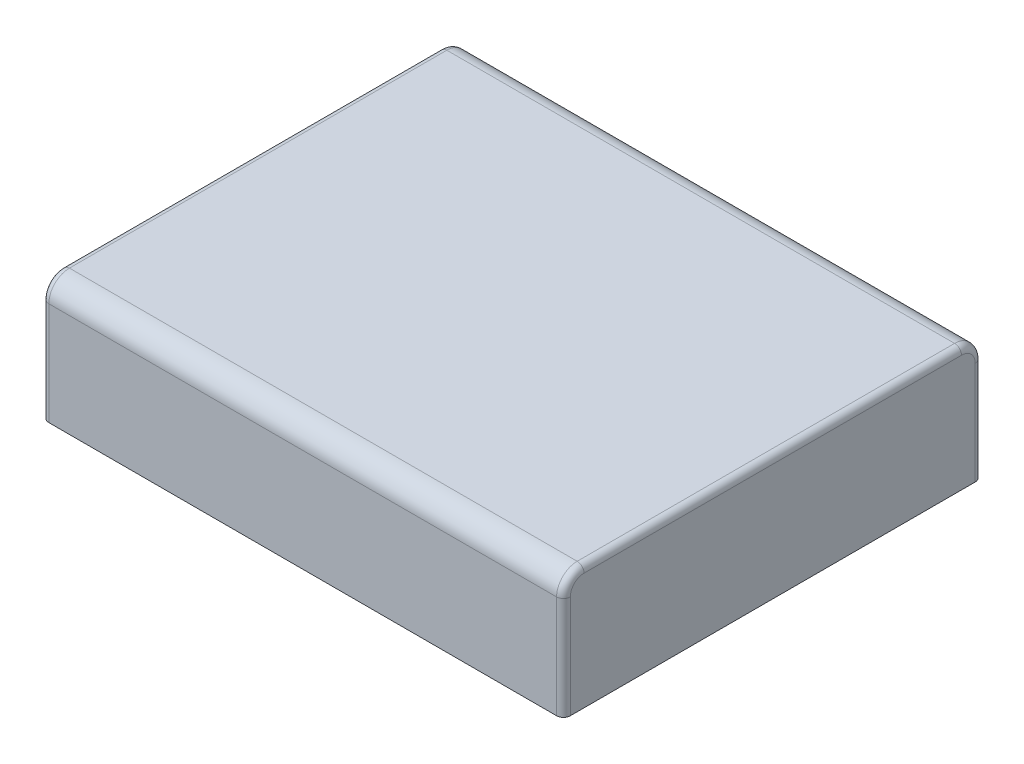
ISO-10303-21;
HEADER;
FILE_DESCRIPTION(('STEP AP214'),'2;1');
FILE_NAME('part.step','',(''),(''),'','','');
FILE_SCHEMA(('AUTOMOTIVE_DESIGN { 1 0 10303 214 1 1 1 1 }'));
ENDSEC;
DATA;
#1=APPLICATION_CONTEXT('core data for automotive mechanical design processes');
#2=APPLICATION_PROTOCOL_DEFINITION('international standard','automotive_design',2000,#1);
#3=PRODUCT_CONTEXT('',#1,'mechanical');
#4=PRODUCT('Part','Part','',(#3));
#5=PRODUCT_RELATED_PRODUCT_CATEGORY('part','',(#4));
#6=PRODUCT_DEFINITION_FORMATION('','',#4);
#7=PRODUCT_DEFINITION_CONTEXT('part definition',#1,'design');
#8=PRODUCT_DEFINITION('design','',#6,#7);
#9=PRODUCT_DEFINITION_SHAPE('','',#8);
#10=(LENGTH_UNIT() NAMED_UNIT(*) SI_UNIT(.MILLI.,.METRE.));
#11=(NAMED_UNIT(*) PLANE_ANGLE_UNIT() SI_UNIT($,.RADIAN.));
#12=(NAMED_UNIT(*) SI_UNIT($,.STERADIAN.) SOLID_ANGLE_UNIT());
#13=UNCERTAINTY_MEASURE_WITH_UNIT(LENGTH_MEASURE(1.E-05),#10,'distance_accuracy_value','');
#14=(GEOMETRIC_REPRESENTATION_CONTEXT(3) GLOBAL_UNCERTAINTY_ASSIGNED_CONTEXT((#13)) GLOBAL_UNIT_ASSIGNED_CONTEXT((#10,
#11,#12)) REPRESENTATION_CONTEXT('',''));
#15=CARTESIAN_POINT('',(0.,0.,0.));
#16=DIRECTION('',(0.,0.,1.));
#17=DIRECTION('',(1.,0.,0.));
#18=AXIS2_PLACEMENT_3D('',#15,#16,#17);
#19=CARTESIAN_POINT('',(38.,18.,-30.5));
#20=DIRECTION('',(-1.,0.,0.));
#21=DIRECTION('',(0.,0.,1.));
#22=AXIS2_PLACEMENT_3D('',#19,#20,#21);
#23=PLANE('',#22);
#24=DIRECTION('',(0.,0.,-1.));
#25=VECTOR('',#24,1.);
#26=CARTESIAN_POINT('',(38.,0.,-30.5));
#27=LINE('',#26,#25);
#28=CARTESIAN_POINT('',(38.,0.,29.5));
#29=VERTEX_POINT('',#28);
#30=CARTESIAN_POINT('',(38.,0.,-29.5));
#31=VERTEX_POINT('',#30);
#32=EDGE_CURVE('E128',#29,#31,#27,.T.);
#33=ORIENTED_EDGE('',*,*,#32,.T.);
#34=DIRECTION('',(0.,-1.,0.));
#35=VECTOR('',#34,1.);
#36=CARTESIAN_POINT('',(38.,18.,-29.5));
#37=LINE('',#36,#35);
#38=CARTESIAN_POINT('',(38.,15.,-29.5));
#39=VERTEX_POINT('',#38);
#40=EDGE_CURVE('E219',#31,#39,#37,.F.);
#41=ORIENTED_EDGE('',*,*,#40,.T.);
#42=CARTESIAN_POINT('',(38.,15.,-27.5));
#43=DIRECTION('',(-1.,0.,0.));
#44=DIRECTION('',(0.,0.,1.));
#45=AXIS2_PLACEMENT_3D('',#42,#43,#44);
#46=CIRCLE('',#45,2.);
#47=CARTESIAN_POINT('',(38.,17.,-27.5));
#48=VERTEX_POINT('',#47);
#49=EDGE_CURVE('E216',#39,#48,#46,.F.);
#50=ORIENTED_EDGE('',*,*,#49,.T.);
#51=DIRECTION('',(0.,0.,-1.));
#52=VECTOR('',#51,1.);
#53=CARTESIAN_POINT('',(38.,17.,27.5));
#54=LINE('',#53,#52);
#55=CARTESIAN_POINT('',(38.,17.,27.5));
#56=VERTEX_POINT('',#55);
#57=EDGE_CURVE('E214',#48,#56,#54,.F.);
#58=ORIENTED_EDGE('',*,*,#57,.T.);
#59=CARTESIAN_POINT('',(38.,15.,27.5));
#60=DIRECTION('',(-1.,0.,0.));
#61=DIRECTION('',(0.,0.,1.));
#62=AXIS2_PLACEMENT_3D('',#59,#60,#61);
#63=CIRCLE('',#62,2.);
#64=CARTESIAN_POINT('',(38.,15.,29.5));
#65=VERTEX_POINT('',#64);
#66=EDGE_CURVE('E131',#56,#65,#63,.F.);
#67=ORIENTED_EDGE('',*,*,#66,.T.);
#68=DIRECTION('',(0.,-1.,0.));
#69=VECTOR('',#68,1.);
#70=CARTESIAN_POINT('',(38.,18.,29.5));
#71=LINE('',#70,#69);
#72=EDGE_CURVE('E126',#65,#29,#71,.T.);
#73=ORIENTED_EDGE('',*,*,#72,.T.);
#74=EDGE_LOOP('',(#33,#41,#50,#58,#67,#73));
#75=FACE_BOUND('',#74,.T.);
#76=ADVANCED_FACE('F34',(#75),#23,.F.);
#77=CARTESIAN_POINT('',(-38.,18.,-30.5));
#78=DIRECTION('',(0.,0.,1.));
#79=DIRECTION('',(1.,0.,0.));
#80=AXIS2_PLACEMENT_3D('',#77,#78,#79);
#81=PLANE('',#80);
#82=DIRECTION('',(-1.,0.,0.));
#83=VECTOR('',#82,1.);
#84=CARTESIAN_POINT('',(-38.,0.,-30.5));
#85=LINE('',#84,#83);
#86=CARTESIAN_POINT('',(37.,0.,-30.5));
#87=VERTEX_POINT('',#86);
#88=CARTESIAN_POINT('',(-37.,0.,-30.5));
#89=VERTEX_POINT('',#88);
#90=EDGE_CURVE('E144',#87,#89,#85,.T.);
#91=ORIENTED_EDGE('',*,*,#90,.T.);
#92=DIRECTION('',(0.,-1.,0.));
#93=VECTOR('',#92,1.);
#94=CARTESIAN_POINT('',(-37.,18.,-30.5));
#95=LINE('',#94,#93);
#96=CARTESIAN_POINT('',(-37.,15.,-30.5));
#97=VERTEX_POINT('',#96);
#98=EDGE_CURVE('E158',#89,#97,#95,.F.);
#99=ORIENTED_EDGE('',*,*,#98,.T.);
#100=DIRECTION('',(-1.,0.,0.));
#101=VECTOR('',#100,1.);
#102=CARTESIAN_POINT('',(38.,15.,-30.5));
#103=LINE('',#102,#101);
#104=CARTESIAN_POINT('',(37.,15.,-30.5));
#105=VERTEX_POINT('',#104);
#106=EDGE_CURVE('E136',#97,#105,#103,.F.);
#107=ORIENTED_EDGE('',*,*,#106,.T.);
#108=DIRECTION('',(0.,-1.,0.));
#109=VECTOR('',#108,1.);
#110=CARTESIAN_POINT('',(37.,18.,-30.5));
#111=LINE('',#110,#109);
#112=EDGE_CURVE('E58',#105,#87,#111,.T.);
#113=ORIENTED_EDGE('',*,*,#112,.T.);
#114=EDGE_LOOP('',(#91,#99,#107,#113));
#115=FACE_BOUND('',#114,.T.);
#116=ADVANCED_FACE('F247',(#115),#81,.F.);
#117=CARTESIAN_POINT('',(-38.,18.,-30.5));
#118=DIRECTION('',(1.,0.,0.));
#119=DIRECTION('',(0.,0.,-1.));
#120=AXIS2_PLACEMENT_3D('',#117,#118,#119);
#121=PLANE('',#120);
#122=CARTESIAN_POINT('',(-38.,15.,-27.5));
#123=DIRECTION('',(1.,0.,0.));
#124=DIRECTION('',(0.,0.,-1.));
#125=AXIS2_PLACEMENT_3D('',#122,#123,#124);
#126=CIRCLE('',#125,2.);
#127=CARTESIAN_POINT('',(-38.,17.,-27.5));
#128=VERTEX_POINT('',#127);
#129=CARTESIAN_POINT('',(-38.,15.,-29.5));
#130=VERTEX_POINT('',#129);
#131=EDGE_CURVE('E236',#128,#130,#126,.F.);
#132=ORIENTED_EDGE('',*,*,#131,.T.);
#133=DIRECTION('',(0.,-1.,0.));
#134=VECTOR('',#133,1.);
#135=CARTESIAN_POINT('',(-38.,18.,-29.5));
#136=LINE('',#135,#134);
#137=CARTESIAN_POINT('',(-38.,0.,-29.5));
#138=VERTEX_POINT('',#137);
#139=EDGE_CURVE('E152',#130,#138,#136,.T.);
#140=ORIENTED_EDGE('',*,*,#139,.T.);
#141=DIRECTION('',(0.,0.,1.));
#142=VECTOR('',#141,1.);
#143=CARTESIAN_POINT('',(-38.,0.,-30.5));
#144=LINE('',#143,#142);
#145=CARTESIAN_POINT('',(-38.,0.,29.5));
#146=VERTEX_POINT('',#145);
#147=EDGE_CURVE('E201',#138,#146,#144,.T.);
#148=ORIENTED_EDGE('',*,*,#147,.T.);
#149=DIRECTION('',(0.,-1.,0.));
#150=VECTOR('',#149,1.);
#151=CARTESIAN_POINT('',(-38.,18.,29.5));
#152=LINE('',#151,#150);
#153=CARTESIAN_POINT('',(-38.,15.,29.5));
#154=VERTEX_POINT('',#153);
#155=EDGE_CURVE('E192',#146,#154,#152,.F.);
#156=ORIENTED_EDGE('',*,*,#155,.T.);
#157=CARTESIAN_POINT('',(-38.,15.,27.5));
#158=DIRECTION('',(1.,0.,0.));
#159=DIRECTION('',(0.,0.,-1.));
#160=AXIS2_PLACEMENT_3D('',#157,#158,#159);
#161=CIRCLE('',#160,2.);
#162=CARTESIAN_POINT('',(-38.,17.,27.5));
#163=VERTEX_POINT('',#162);
#164=EDGE_CURVE('E187',#154,#163,#161,.F.);
#165=ORIENTED_EDGE('',*,*,#164,.T.);
#166=DIRECTION('',(0.,0.,1.));
#167=VECTOR('',#166,1.);
#168=CARTESIAN_POINT('',(-38.,17.,-27.5));
#169=LINE('',#168,#167);
#170=EDGE_CURVE('E234',#163,#128,#169,.F.);
#171=ORIENTED_EDGE('',*,*,#170,.T.);
#172=EDGE_LOOP('',(#132,#140,#148,#156,#165,#171));
#173=FACE_BOUND('',#172,.T.);
#174=ADVANCED_FACE('F240',(#173),#121,.F.);
#175=CARTESIAN_POINT('',(-38.,18.,30.5));
#176=DIRECTION('',(0.,0.,-1.));
#177=DIRECTION('',(-1.,0.,0.));
#178=AXIS2_PLACEMENT_3D('',#175,#176,#177);
#179=PLANE('',#178);
#180=DIRECTION('',(1.,0.,0.));
#181=VECTOR('',#180,1.);
#182=CARTESIAN_POINT('',(-38.,0.,30.5));
#183=LINE('',#182,#181);
#184=CARTESIAN_POINT('',(-37.,0.,30.5));
#185=VERTEX_POINT('',#184);
#186=CARTESIAN_POINT('',(37.,0.,30.5));
#187=VERTEX_POINT('',#186);
#188=EDGE_CURVE('E196',#185,#187,#183,.T.);
#189=ORIENTED_EDGE('',*,*,#188,.T.);
#190=DIRECTION('',(0.,-1.,0.));
#191=VECTOR('',#190,1.);
#192=CARTESIAN_POINT('',(37.,18.,30.5));
#193=LINE('',#192,#191);
#194=CARTESIAN_POINT('',(37.,15.,30.5));
#195=VERTEX_POINT('',#194);
#196=EDGE_CURVE('E11',#187,#195,#193,.F.);
#197=ORIENTED_EDGE('',*,*,#196,.T.);
#198=DIRECTION('',(1.,0.,0.));
#199=VECTOR('',#198,1.);
#200=CARTESIAN_POINT('',(-38.,15.,30.5));
#201=LINE('',#200,#199);
#202=CARTESIAN_POINT('',(-37.,15.,30.5));
#203=VERTEX_POINT('',#202);
#204=EDGE_CURVE('E198',#195,#203,#201,.F.);
#205=ORIENTED_EDGE('',*,*,#204,.T.);
#206=DIRECTION('',(0.,-1.,0.));
#207=VECTOR('',#206,1.);
#208=CARTESIAN_POINT('',(-37.,18.,30.5));
#209=LINE('',#208,#207);
#210=EDGE_CURVE('E43',#203,#185,#209,.T.);
#211=ORIENTED_EDGE('',*,*,#210,.T.);
#212=EDGE_LOOP('',(#189,#197,#205,#211));
#213=FACE_BOUND('',#212,.T.);
#214=ADVANCED_FACE('F195',(#213),#179,.F.);
#215=CARTESIAN_POINT('',(0.,18.,0.));
#216=DIRECTION('',(0.,1.,0.));
#217=DIRECTION('',(0.,0.,1.));
#218=AXIS2_PLACEMENT_3D('',#215,#216,#217);
#219=PLANE('',#218);
#220=DIRECTION('',(1.,0.,0.));
#221=VECTOR('',#220,1.);
#222=CARTESIAN_POINT('',(38.,18.,27.5));
#223=LINE('',#222,#221);
#224=CARTESIAN_POINT('',(-37.,18.,27.5));
#225=VERTEX_POINT('',#224);
#226=CARTESIAN_POINT('',(37.,18.,27.5));
#227=VERTEX_POINT('',#226);
#228=EDGE_CURVE('E204',#225,#227,#223,.T.);
#229=ORIENTED_EDGE('',*,*,#228,.T.);
#230=DIRECTION('',(0.,0.,-1.));
#231=VECTOR('',#230,1.);
#232=CARTESIAN_POINT('',(37.,18.,-27.5));
#233=LINE('',#232,#231);
#234=CARTESIAN_POINT('',(37.,18.,-27.5));
#235=VERTEX_POINT('',#234);
#236=EDGE_CURVE('E227',#227,#235,#233,.T.);
#237=ORIENTED_EDGE('',*,*,#236,.T.);
#238=DIRECTION('',(-1.,0.,0.));
#239=VECTOR('',#238,1.);
#240=CARTESIAN_POINT('',(-38.,18.,-27.5));
#241=LINE('',#240,#239);
#242=CARTESIAN_POINT('',(-37.,18.,-27.5));
#243=VERTEX_POINT('',#242);
#244=EDGE_CURVE('E200',#235,#243,#241,.T.);
#245=ORIENTED_EDGE('',*,*,#244,.T.);
#246=DIRECTION('',(0.,0.,1.));
#247=VECTOR('',#246,1.);
#248=CARTESIAN_POINT('',(-37.,18.,27.5));
#249=LINE('',#248,#247);
#250=EDGE_CURVE('E225',#243,#225,#249,.T.);
#251=ORIENTED_EDGE('',*,*,#250,.T.);
#252=EDGE_LOOP('',(#229,#237,#245,#251));
#253=FACE_BOUND('',#252,.T.);
#254=ADVANCED_FACE('F259',(#253),#219,.T.);
#255=CARTESIAN_POINT('',(0.,0.,0.));
#256=DIRECTION('',(0.,1.,0.));
#257=DIRECTION('',(0.,0.,1.));
#258=AXIS2_PLACEMENT_3D('',#255,#256,#257);
#259=PLANE('',#258);
#260=ORIENTED_EDGE('',*,*,#147,.F.);
#261=CARTESIAN_POINT('',(-37.,0.,-29.5));
#262=DIRECTION('',(0.,1.,0.));
#263=DIRECTION('',(0.,0.,1.));
#264=AXIS2_PLACEMENT_3D('',#261,#262,#263);
#265=CIRCLE('',#264,1.);
#266=EDGE_CURVE('E51',#138,#89,#265,.F.);
#267=ORIENTED_EDGE('',*,*,#266,.T.);
#268=ORIENTED_EDGE('',*,*,#90,.F.);
#269=CARTESIAN_POINT('',(37.,0.,-29.5));
#270=DIRECTION('',(0.,1.,0.));
#271=DIRECTION('',(0.,0.,1.));
#272=AXIS2_PLACEMENT_3D('',#269,#270,#271);
#273=CIRCLE('',#272,1.);
#274=EDGE_CURVE('E143',#87,#31,#273,.F.);
#275=ORIENTED_EDGE('',*,*,#274,.T.);
#276=ORIENTED_EDGE('',*,*,#32,.F.);
#277=CARTESIAN_POINT('',(37.,0.,29.5));
#278=DIRECTION('',(0.,1.,0.));
#279=DIRECTION('',(0.,0.,1.));
#280=AXIS2_PLACEMENT_3D('',#277,#278,#279);
#281=CIRCLE('',#280,1.);
#282=EDGE_CURVE('E140',#29,#187,#281,.F.);
#283=ORIENTED_EDGE('',*,*,#282,.T.);
#284=ORIENTED_EDGE('',*,*,#188,.F.);
#285=CARTESIAN_POINT('',(-37.,0.,29.5));
#286=DIRECTION('',(0.,1.,0.));
#287=DIRECTION('',(0.,0.,1.));
#288=AXIS2_PLACEMENT_3D('',#285,#286,#287);
#289=CIRCLE('',#288,1.);
#290=EDGE_CURVE('E149',#185,#146,#289,.F.);
#291=ORIENTED_EDGE('',*,*,#290,.T.);
#292=EDGE_LOOP('',(#260,#267,#268,#275,#276,#283,#284,#291));
#293=FACE_BOUND('',#292,.T.);
#294=ADVANCED_FACE('F138',(#293),#259,.F.);
#295=CARTESIAN_POINT('',(0.,15.,27.5));
#296=DIRECTION('',(-1.,0.,0.));
#297=DIRECTION('',(0.,0.,1.));
#298=AXIS2_PLACEMENT_3D('',#295,#296,#297);
#299=CYLINDRICAL_SURFACE('',#298,3.);
#300=ORIENTED_EDGE('',*,*,#204,.F.);
#301=CARTESIAN_POINT('',(37.,15.,27.5));
#302=DIRECTION('',(-1.,0.,0.));
#303=DIRECTION('',(0.,0.,1.));
#304=AXIS2_PLACEMENT_3D('',#301,#302,#303);
#305=CIRCLE('',#304,3.);
#306=EDGE_CURVE('E230',#195,#227,#305,.T.);
#307=ORIENTED_EDGE('',*,*,#306,.T.);
#308=ORIENTED_EDGE('',*,*,#228,.F.);
#309=CARTESIAN_POINT('',(-37.,15.,27.5));
#310=DIRECTION('',(1.,0.,0.));
#311=DIRECTION('',(0.,0.,-1.));
#312=AXIS2_PLACEMENT_3D('',#309,#310,#311);
#313=CIRCLE('',#312,3.);
#314=EDGE_CURVE('E186',#225,#203,#313,.T.);
#315=ORIENTED_EDGE('',*,*,#314,.T.);
#316=EDGE_LOOP('',(#300,#307,#308,#315));
#317=FACE_BOUND('',#316,.T.);
#318=ADVANCED_FACE('F262',(#317),#299,.T.);
#319=CARTESIAN_POINT('',(0.,15.,-27.5));
#320=DIRECTION('',(1.,0.,0.));
#321=DIRECTION('',(0.,0.,-1.));
#322=AXIS2_PLACEMENT_3D('',#319,#320,#321);
#323=CYLINDRICAL_SURFACE('',#322,3.);
#324=ORIENTED_EDGE('',*,*,#244,.F.);
#325=CARTESIAN_POINT('',(37.,15.,-27.5));
#326=DIRECTION('',(-1.,0.,0.));
#327=DIRECTION('',(0.,0.,1.));
#328=AXIS2_PLACEMENT_3D('',#325,#326,#327);
#329=CIRCLE('',#328,3.);
#330=EDGE_CURVE('E223',#235,#105,#329,.T.);
#331=ORIENTED_EDGE('',*,*,#330,.T.);
#332=ORIENTED_EDGE('',*,*,#106,.F.);
#333=CARTESIAN_POINT('',(-37.,15.,-27.5));
#334=DIRECTION('',(1.,0.,0.));
#335=DIRECTION('',(0.,0.,-1.));
#336=AXIS2_PLACEMENT_3D('',#333,#334,#335);
#337=CIRCLE('',#336,3.);
#338=EDGE_CURVE('E221',#97,#243,#337,.T.);
#339=ORIENTED_EDGE('',*,*,#338,.T.);
#340=EDGE_LOOP('',(#324,#331,#332,#339));
#341=FACE_BOUND('',#340,.T.);
#342=ADVANCED_FACE('F251',(#341),#323,.T.);
#343=CARTESIAN_POINT('',(37.,18.,29.5));
#344=DIRECTION('',(0.,-1.,0.));
#345=DIRECTION('',(0.,0.,-1.));
#346=AXIS2_PLACEMENT_3D('',#343,#344,#345);
#347=CYLINDRICAL_SURFACE('',#346,1.);
#348=ORIENTED_EDGE('',*,*,#282,.F.);
#349=ORIENTED_EDGE('',*,*,#72,.F.);
#350=CARTESIAN_POINT('',(37.,15.,29.5));
#351=DIRECTION('',(0.,1.,0.));
#352=DIRECTION('',(0.,0.,1.));
#353=AXIS2_PLACEMENT_3D('',#350,#351,#352);
#354=CIRCLE('',#353,1.);
#355=EDGE_CURVE('E145',#195,#65,#354,.T.);
#356=ORIENTED_EDGE('',*,*,#355,.F.);
#357=ORIENTED_EDGE('',*,*,#196,.F.);
#358=EDGE_LOOP('',(#348,#349,#356,#357));
#359=FACE_BOUND('',#358,.T.);
#360=ADVANCED_FACE('F148',(#359),#347,.T.);
#361=CARTESIAN_POINT('',(37.,15.,27.5));
#362=DIRECTION('',(-1.,0.,0.));
#363=DIRECTION('',(0.,0.,1.));
#364=AXIS2_PLACEMENT_3D('',#361,#362,#363);
#365=TOROIDAL_SURFACE('',#364,2.,1.);
#366=ORIENTED_EDGE('',*,*,#355,.T.);
#367=ORIENTED_EDGE('',*,*,#66,.F.);
#368=CARTESIAN_POINT('',(37.,17.,27.5));
#369=DIRECTION('',(0.,0.,-1.));
#370=DIRECTION('',(-1.,0.,0.));
#371=AXIS2_PLACEMENT_3D('',#368,#369,#370);
#372=CIRCLE('',#371,1.);
#373=EDGE_CURVE('E166',#227,#56,#372,.T.);
#374=ORIENTED_EDGE('',*,*,#373,.F.);
#375=ORIENTED_EDGE('',*,*,#306,.F.);
#376=EDGE_LOOP('',(#366,#367,#374,#375));
#377=FACE_BOUND('',#376,.T.);
#378=ADVANCED_FACE('F265',(#377),#365,.T.);
#379=CARTESIAN_POINT('',(37.,18.,-29.5));
#380=DIRECTION('',(0.,-1.,0.));
#381=DIRECTION('',(0.,0.,-1.));
#382=AXIS2_PLACEMENT_3D('',#379,#380,#381);
#383=CYLINDRICAL_SURFACE('',#382,1.);
#384=ORIENTED_EDGE('',*,*,#274,.F.);
#385=ORIENTED_EDGE('',*,*,#112,.F.);
#386=CARTESIAN_POINT('',(37.,15.,-29.5));
#387=DIRECTION('',(0.,1.,0.));
#388=DIRECTION('',(0.,0.,1.));
#389=AXIS2_PLACEMENT_3D('',#386,#387,#388);
#390=CIRCLE('',#389,1.);
#391=EDGE_CURVE('E163',#39,#105,#390,.T.);
#392=ORIENTED_EDGE('',*,*,#391,.F.);
#393=ORIENTED_EDGE('',*,*,#40,.F.);
#394=EDGE_LOOP('',(#384,#385,#392,#393));
#395=FACE_BOUND('',#394,.T.);
#396=ADVANCED_FACE('F276',(#395),#383,.T.);
#397=CARTESIAN_POINT('',(37.,17.,0.));
#398=DIRECTION('',(0.,0.,1.));
#399=DIRECTION('',(1.,0.,0.));
#400=AXIS2_PLACEMENT_3D('',#397,#398,#399);
#401=CYLINDRICAL_SURFACE('',#400,1.);
#402=ORIENTED_EDGE('',*,*,#373,.T.);
#403=ORIENTED_EDGE('',*,*,#57,.F.);
#404=CARTESIAN_POINT('',(37.,17.,-27.5));
#405=DIRECTION('',(0.,0.,-1.));
#406=DIRECTION('',(-1.,0.,0.));
#407=AXIS2_PLACEMENT_3D('',#404,#405,#406);
#408=CIRCLE('',#407,1.);
#409=EDGE_CURVE('E161',#235,#48,#408,.T.);
#410=ORIENTED_EDGE('',*,*,#409,.F.);
#411=ORIENTED_EDGE('',*,*,#236,.F.);
#412=EDGE_LOOP('',(#402,#403,#410,#411));
#413=FACE_BOUND('',#412,.T.);
#414=ADVANCED_FACE('F270',(#413),#401,.T.);
#415=CARTESIAN_POINT('',(37.,15.,-27.5));
#416=DIRECTION('',(-1.,0.,0.));
#417=DIRECTION('',(0.,0.,1.));
#418=AXIS2_PLACEMENT_3D('',#415,#416,#417);
#419=TOROIDAL_SURFACE('',#418,2.,1.);
#420=ORIENTED_EDGE('',*,*,#391,.T.);
#421=ORIENTED_EDGE('',*,*,#330,.F.);
#422=ORIENTED_EDGE('',*,*,#409,.T.);
#423=ORIENTED_EDGE('',*,*,#49,.F.);
#424=EDGE_LOOP('',(#420,#421,#422,#423));
#425=FACE_BOUND('',#424,.T.);
#426=ADVANCED_FACE('F272',(#425),#419,.T.);
#427=CARTESIAN_POINT('',(-37.,18.,29.5));
#428=DIRECTION('',(0.,-1.,0.));
#429=DIRECTION('',(0.,0.,-1.));
#430=AXIS2_PLACEMENT_3D('',#427,#428,#429);
#431=CYLINDRICAL_SURFACE('',#430,1.);
#432=ORIENTED_EDGE('',*,*,#290,.F.);
#433=ORIENTED_EDGE('',*,*,#210,.F.);
#434=CARTESIAN_POINT('',(-37.,15.,29.5));
#435=DIRECTION('',(0.,1.,0.));
#436=DIRECTION('',(0.,0.,1.));
#437=AXIS2_PLACEMENT_3D('',#434,#435,#436);
#438=CIRCLE('',#437,1.);
#439=EDGE_CURVE('E38',#154,#203,#438,.T.);
#440=ORIENTED_EDGE('',*,*,#439,.F.);
#441=ORIENTED_EDGE('',*,*,#155,.F.);
#442=EDGE_LOOP('',(#432,#433,#440,#441));
#443=FACE_BOUND('',#442,.T.);
#444=ADVANCED_FACE('F36',(#443),#431,.T.);
#445=CARTESIAN_POINT('',(-37.,15.,27.5));
#446=DIRECTION('',(1.,0.,0.));
#447=DIRECTION('',(0.,0.,-1.));
#448=AXIS2_PLACEMENT_3D('',#445,#446,#447);
#449=TOROIDAL_SURFACE('',#448,2.,1.);
#450=ORIENTED_EDGE('',*,*,#439,.T.);
#451=ORIENTED_EDGE('',*,*,#314,.F.);
#452=CARTESIAN_POINT('',(-37.,17.,27.5));
#453=DIRECTION('',(0.,0.,-1.));
#454=DIRECTION('',(-1.,0.,0.));
#455=AXIS2_PLACEMENT_3D('',#452,#453,#454);
#456=CIRCLE('',#455,1.);
#457=EDGE_CURVE('E174',#163,#225,#456,.T.);
#458=ORIENTED_EDGE('',*,*,#457,.F.);
#459=ORIENTED_EDGE('',*,*,#164,.F.);
#460=EDGE_LOOP('',(#450,#451,#458,#459));
#461=FACE_BOUND('',#460,.T.);
#462=ADVANCED_FACE('F185',(#461),#449,.T.);
#463=CARTESIAN_POINT('',(-37.,17.,0.));
#464=DIRECTION('',(0.,0.,-1.));
#465=DIRECTION('',(-1.,0.,0.));
#466=AXIS2_PLACEMENT_3D('',#463,#464,#465);
#467=CYLINDRICAL_SURFACE('',#466,1.);
#468=ORIENTED_EDGE('',*,*,#457,.T.);
#469=ORIENTED_EDGE('',*,*,#250,.F.);
#470=CARTESIAN_POINT('',(-37.,17.,-27.5));
#471=DIRECTION('',(0.,0.,-1.));
#472=DIRECTION('',(-1.,0.,0.));
#473=AXIS2_PLACEMENT_3D('',#470,#471,#472);
#474=CIRCLE('',#473,1.);
#475=EDGE_CURVE('E172',#128,#243,#474,.T.);
#476=ORIENTED_EDGE('',*,*,#475,.F.);
#477=ORIENTED_EDGE('',*,*,#170,.F.);
#478=EDGE_LOOP('',(#468,#469,#476,#477));
#479=FACE_BOUND('',#478,.T.);
#480=ADVANCED_FACE('F256',(#479),#467,.T.);
#481=CARTESIAN_POINT('',(-37.,18.,-29.5));
#482=DIRECTION('',(0.,-1.,0.));
#483=DIRECTION('',(0.,0.,-1.));
#484=AXIS2_PLACEMENT_3D('',#481,#482,#483);
#485=CYLINDRICAL_SURFACE('',#484,1.);
#486=ORIENTED_EDGE('',*,*,#266,.F.);
#487=ORIENTED_EDGE('',*,*,#139,.F.);
#488=CARTESIAN_POINT('',(-37.,15.,-29.5));
#489=DIRECTION('',(0.,1.,0.));
#490=DIRECTION('',(0.,0.,1.));
#491=AXIS2_PLACEMENT_3D('',#488,#489,#490);
#492=CIRCLE('',#491,1.);
#493=EDGE_CURVE('E170',#97,#130,#492,.T.);
#494=ORIENTED_EDGE('',*,*,#493,.F.);
#495=ORIENTED_EDGE('',*,*,#98,.F.);
#496=EDGE_LOOP('',(#486,#487,#494,#495));
#497=FACE_BOUND('',#496,.T.);
#498=ADVANCED_FACE('F245',(#497),#485,.T.);
#499=CARTESIAN_POINT('',(-37.,15.,-27.5));
#500=DIRECTION('',(1.,0.,0.));
#501=DIRECTION('',(0.,0.,-1.));
#502=AXIS2_PLACEMENT_3D('',#499,#500,#501);
#503=TOROIDAL_SURFACE('',#502,2.,1.);
#504=ORIENTED_EDGE('',*,*,#475,.T.);
#505=ORIENTED_EDGE('',*,*,#338,.F.);
#506=ORIENTED_EDGE('',*,*,#493,.T.);
#507=ORIENTED_EDGE('',*,*,#131,.F.);
#508=EDGE_LOOP('',(#504,#505,#506,#507));
#509=FACE_BOUND('',#508,.T.);
#510=ADVANCED_FACE('F254',(#509),#503,.T.);
#511=CLOSED_SHELL('',(#76,#116,#174,#214,#254,#294,#318,#342,#360,#378,#396,#414,#426,#444,#462,
#480,#498,#510));
#512=MANIFOLD_SOLID_BREP('B2',#511);
#513=ADVANCED_BREP_SHAPE_REPRESENTATION('',(#18,#512),#14);
#514=SHAPE_DEFINITION_REPRESENTATION(#9,#513);
ENDSEC;
END-ISO-10303-21;
